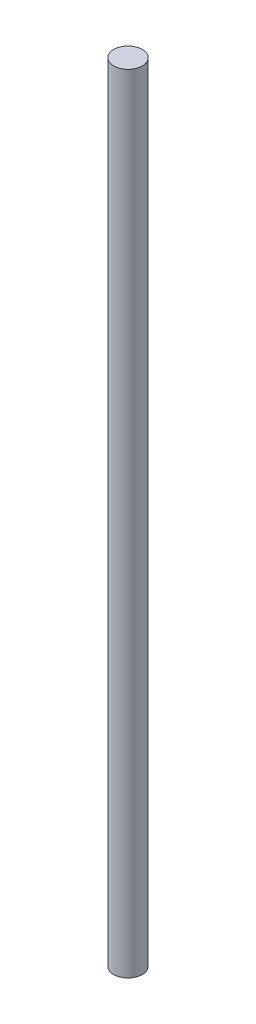
ISO-10303-21;
HEADER;
FILE_DESCRIPTION(('STEP AP214'),'2;1');
FILE_NAME('part.step','',(''),(''),'','','');
FILE_SCHEMA(('AUTOMOTIVE_DESIGN { 1 0 10303 214 1 1 1 1 }'));
ENDSEC;
DATA;
#1=APPLICATION_CONTEXT('core data for automotive mechanical design processes');
#2=APPLICATION_PROTOCOL_DEFINITION('international standard','automotive_design',2000,#1);
#3=PRODUCT_CONTEXT('',#1,'mechanical');
#4=PRODUCT('Part','Part','',(#3));
#5=PRODUCT_RELATED_PRODUCT_CATEGORY('part','',(#4));
#6=PRODUCT_DEFINITION_FORMATION('','',#4);
#7=PRODUCT_DEFINITION_CONTEXT('part definition',#1,'design');
#8=PRODUCT_DEFINITION('design','',#6,#7);
#9=PRODUCT_DEFINITION_SHAPE('','',#8);
#10=(LENGTH_UNIT() NAMED_UNIT(*) SI_UNIT(.MILLI.,.METRE.));
#11=(NAMED_UNIT(*) PLANE_ANGLE_UNIT() SI_UNIT($,.RADIAN.));
#12=(NAMED_UNIT(*) SI_UNIT($,.STERADIAN.) SOLID_ANGLE_UNIT());
#13=UNCERTAINTY_MEASURE_WITH_UNIT(LENGTH_MEASURE(1.E-05),#10,'distance_accuracy_value','');
#14=(GEOMETRIC_REPRESENTATION_CONTEXT(3) GLOBAL_UNCERTAINTY_ASSIGNED_CONTEXT((#13)) GLOBAL_UNIT_ASSIGNED_CONTEXT((#10,
#11,#12)) REPRESENTATION_CONTEXT('',''));
#15=CARTESIAN_POINT('',(0.,0.,0.));
#16=DIRECTION('',(0.,0.,1.));
#17=DIRECTION('',(1.,0.,0.));
#18=AXIS2_PLACEMENT_3D('',#15,#16,#17);
#19=CARTESIAN_POINT('',(0.,165.,0.));
#20=DIRECTION('',(0.,-1.,0.));
#21=DIRECTION('',(0.,0.,-1.));
#22=AXIS2_PLACEMENT_3D('',#19,#20,#21);
#23=CYLINDRICAL_SURFACE('',#22,3.);
#24=CARTESIAN_POINT('',(0.,165.,0.));
#25=DIRECTION('',(0.,1.,0.));
#26=DIRECTION('',(0.,0.,1.));
#27=AXIS2_PLACEMENT_3D('',#24,#25,#26);
#28=CIRCLE('',#27,3.);
#29=CARTESIAN_POINT('',(0.,165.,3.));
#30=VERTEX_POINT('',#29);
#31=EDGE_CURVE('E10',#30,#30,#28,.T.);
#32=ORIENTED_EDGE('',*,*,#31,.F.);
#33=EDGE_LOOP('',(#32));
#34=FACE_BOUND('',#33,.T.);
#35=CARTESIAN_POINT('',(0.,0.,0.));
#36=DIRECTION('',(0.,1.,0.));
#37=DIRECTION('',(0.,0.,1.));
#38=AXIS2_PLACEMENT_3D('',#35,#36,#37);
#39=CIRCLE('',#38,3.);
#40=CARTESIAN_POINT('',(0.,0.,3.));
#41=VERTEX_POINT('',#40);
#42=EDGE_CURVE('E38',#41,#41,#39,.T.);
#43=ORIENTED_EDGE('',*,*,#42,.T.);
#44=EDGE_LOOP('',(#43));
#45=FACE_BOUND('',#44,.T.);
#46=ADVANCED_FACE('F35',(#34,#45),#23,.T.);
#47=CARTESIAN_POINT('',(0.,165.,0.));
#48=DIRECTION('',(0.,1.,0.));
#49=DIRECTION('',(0.,0.,1.));
#50=AXIS2_PLACEMENT_3D('',#47,#48,#49);
#51=PLANE('',#50);
#52=ORIENTED_EDGE('',*,*,#31,.T.);
#53=EDGE_LOOP('',(#52));
#54=FACE_BOUND('',#53,.T.);
#55=ADVANCED_FACE('F50',(#54),#51,.T.);
#56=CARTESIAN_POINT('',(0.,0.,0.));
#57=DIRECTION('',(0.,1.,0.));
#58=DIRECTION('',(0.,0.,1.));
#59=AXIS2_PLACEMENT_3D('',#56,#57,#58);
#60=PLANE('',#59);
#61=ORIENTED_EDGE('',*,*,#42,.F.);
#62=EDGE_LOOP('',(#61));
#63=FACE_BOUND('',#62,.T.);
#64=ADVANCED_FACE('F48',(#63),#60,.F.);
#65=CLOSED_SHELL('',(#46,#55,#64));
#66=MANIFOLD_SOLID_BREP('B2',#65);
#67=ADVANCED_BREP_SHAPE_REPRESENTATION('',(#18,#66),#14);
#68=SHAPE_DEFINITION_REPRESENTATION(#9,#67);
ENDSEC;
END-ISO-10303-21;
